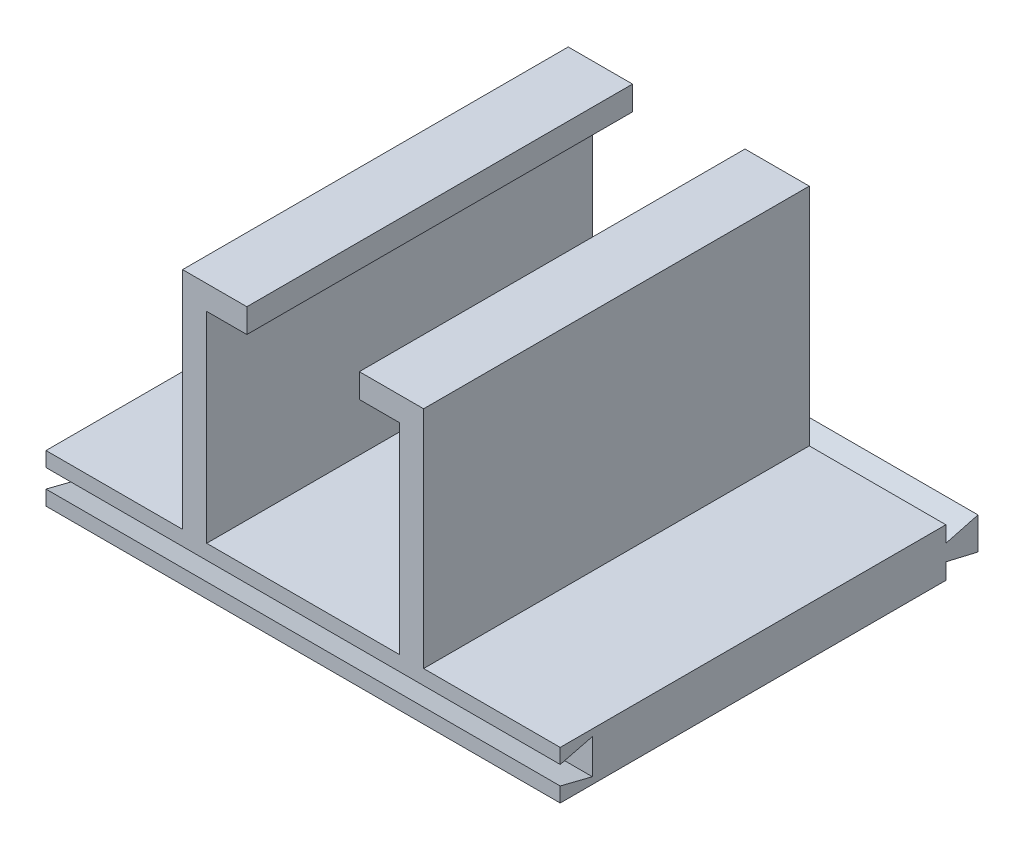
ISO-10303-21;
HEADER;
FILE_DESCRIPTION(('STEP AP214'),'2;1');
FILE_NAME('part.step','',(''),(''),'','','');
FILE_SCHEMA(('AUTOMOTIVE_DESIGN { 1 0 10303 214 1 1 1 1 }'));
ENDSEC;
DATA;
#1=APPLICATION_CONTEXT('core data for automotive mechanical design processes');
#2=APPLICATION_PROTOCOL_DEFINITION('international standard','automotive_design',2000,#1);
#3=PRODUCT_CONTEXT('',#1,'mechanical');
#4=PRODUCT('Part','Part','',(#3));
#5=PRODUCT_RELATED_PRODUCT_CATEGORY('part','',(#4));
#6=PRODUCT_DEFINITION_FORMATION('','',#4);
#7=PRODUCT_DEFINITION_CONTEXT('part definition',#1,'design');
#8=PRODUCT_DEFINITION('design','',#6,#7);
#9=PRODUCT_DEFINITION_SHAPE('','',#8);
#10=(LENGTH_UNIT() NAMED_UNIT(*) SI_UNIT(.MILLI.,.METRE.));
#11=(NAMED_UNIT(*) PLANE_ANGLE_UNIT() SI_UNIT($,.RADIAN.));
#12=(NAMED_UNIT(*) SI_UNIT($,.STERADIAN.) SOLID_ANGLE_UNIT());
#13=UNCERTAINTY_MEASURE_WITH_UNIT(LENGTH_MEASURE(1.E-05),#10,'distance_accuracy_value','');
#14=(GEOMETRIC_REPRESENTATION_CONTEXT(3) GLOBAL_UNCERTAINTY_ASSIGNED_CONTEXT((#13)) GLOBAL_UNIT_ASSIGNED_CONTEXT((#10,
#11,#12)) REPRESENTATION_CONTEXT('',''));
#15=CARTESIAN_POINT('',(0.,0.,0.));
#16=DIRECTION('',(0.,0.,1.));
#17=DIRECTION('',(1.,0.,0.));
#18=AXIS2_PLACEMENT_3D('',#15,#16,#17);
#19=CARTESIAN_POINT('',(0.,9.525,0.));
#20=DIRECTION('',(0.,0.,-1.));
#21=DIRECTION('',(-1.,0.,0.));
#22=AXIS2_PLACEMENT_3D('',#19,#20,#21);
#23=PLANE('',#22);
#24=DIRECTION('',(0.,-1.,0.));
#25=VECTOR('',#24,1.);
#26=CARTESIAN_POINT('',(101.6,9.525,0.));
#27=LINE('',#26,#25);
#28=CARTESIAN_POINT('',(101.6,2.921,0.));
#29=VERTEX_POINT('',#28);
#30=CARTESIAN_POINT('',(101.6,0.,0.));
#31=VERTEX_POINT('',#30);
#32=EDGE_CURVE('E434',#29,#31,#27,.T.);
#33=ORIENTED_EDGE('',*,*,#32,.F.);
#34=DIRECTION('',(1.,0.,0.));
#35=VECTOR('',#34,1.);
#36=CARTESIAN_POINT('',(0.,2.921,0.));
#37=LINE('',#36,#35);
#38=CARTESIAN_POINT('',(0.,2.921,0.));
#39=VERTEX_POINT('',#38);
#40=EDGE_CURVE('E234',#39,#29,#37,.T.);
#41=ORIENTED_EDGE('',*,*,#40,.F.);
#42=DIRECTION('',(0.,-1.,0.));
#43=VECTOR('',#42,1.);
#44=CARTESIAN_POINT('',(0.,9.525,0.));
#45=LINE('',#44,#43);
#46=CARTESIAN_POINT('',(0.,0.,0.));
#47=VERTEX_POINT('',#46);
#48=EDGE_CURVE('E48',#39,#47,#45,.T.);
#49=ORIENTED_EDGE('',*,*,#48,.T.);
#50=DIRECTION('',(1.,0.,0.));
#51=VECTOR('',#50,1.);
#52=CARTESIAN_POINT('',(0.,0.,0.));
#53=LINE('',#52,#51);
#54=EDGE_CURVE('E415',#47,#31,#53,.T.);
#55=ORIENTED_EDGE('',*,*,#54,.T.);
#56=EDGE_LOOP('',(#33,#41,#49,#55));
#57=FACE_BOUND('',#56,.T.);
#58=ADVANCED_FACE('F39',(#57),#23,.F.);
#59=CARTESIAN_POINT('',(0.,9.525,-76.2));
#60=DIRECTION('',(0.,0.,1.));
#61=DIRECTION('',(1.,0.,0.));
#62=AXIS2_PLACEMENT_3D('',#59,#60,#61);
#63=PLANE('',#62);
#64=DIRECTION('',(1.,0.,0.));
#65=VECTOR('',#64,1.);
#66=CARTESIAN_POINT('',(0.,6.35,-76.2));
#67=LINE('',#66,#65);
#68=CARTESIAN_POINT('',(0.,6.35,-76.2));
#69=VERTEX_POINT('',#68);
#70=CARTESIAN_POINT('',(101.6,6.35,-76.2));
#71=VERTEX_POINT('',#70);
#72=EDGE_CURVE('E269',#69,#71,#67,.T.);
#73=ORIENTED_EDGE('',*,*,#72,.F.);
#74=DIRECTION('',(0.,-1.,0.));
#75=VECTOR('',#74,1.);
#76=CARTESIAN_POINT('',(0.,9.525,-76.2));
#77=LINE('',#76,#75);
#78=CARTESIAN_POINT('',(0.,9.525,-76.2));
#79=VERTEX_POINT('',#78);
#80=EDGE_CURVE('E426',#79,#69,#77,.T.);
#81=ORIENTED_EDGE('',*,*,#80,.F.);
#82=DIRECTION('',(-1.,0.,0.));
#83=VECTOR('',#82,1.);
#84=CARTESIAN_POINT('',(0.,9.525,-76.2));
#85=LINE('',#84,#83);
#86=CARTESIAN_POINT('',(26.9875,9.525,-76.2));
#87=VERTEX_POINT('',#86);
#88=EDGE_CURVE('E407',#87,#79,#85,.T.);
#89=ORIENTED_EDGE('',*,*,#88,.F.);
#90=DIRECTION('',(0.,-1.,0.));
#91=VECTOR('',#90,1.);
#92=CARTESIAN_POINT('',(26.9875,53.975,-76.2));
#93=LINE('',#92,#91);
#94=CARTESIAN_POINT('',(26.9875,53.975,-76.2));
#95=VERTEX_POINT('',#94);
#96=EDGE_CURVE('E372',#95,#87,#93,.T.);
#97=ORIENTED_EDGE('',*,*,#96,.F.);
#98=DIRECTION('',(-1.,0.,0.));
#99=VECTOR('',#98,1.);
#100=CARTESIAN_POINT('',(26.9875,53.975,-76.2));
#101=LINE('',#100,#99);
#102=CARTESIAN_POINT('',(39.6875,53.975,-76.2));
#103=VERTEX_POINT('',#102);
#104=EDGE_CURVE('E369',#103,#95,#101,.T.);
#105=ORIENTED_EDGE('',*,*,#104,.F.);
#106=DIRECTION('',(0.,1.,0.));
#107=VECTOR('',#106,1.);
#108=CARTESIAN_POINT('',(39.6875,53.975,-76.2));
#109=LINE('',#108,#107);
#110=CARTESIAN_POINT('',(39.6875,49.2125,-76.2));
#111=VERTEX_POINT('',#110);
#112=EDGE_CURVE('E343',#111,#103,#109,.T.);
#113=ORIENTED_EDGE('',*,*,#112,.F.);
#114=DIRECTION('',(-1.,0.,0.));
#115=VECTOR('',#114,1.);
#116=CARTESIAN_POINT('',(39.6875,49.2125,-76.2));
#117=LINE('',#116,#115);
#118=CARTESIAN_POINT('',(31.75,49.2125,-76.2));
#119=VERTEX_POINT('',#118);
#120=EDGE_CURVE('E351',#111,#119,#117,.T.);
#121=ORIENTED_EDGE('',*,*,#120,.T.);
#122=DIRECTION('',(0.,-1.,0.));
#123=VECTOR('',#122,1.);
#124=CARTESIAN_POINT('',(31.75,53.975,-76.2));
#125=LINE('',#124,#123);
#126=CARTESIAN_POINT('',(31.75,9.525,-76.2));
#127=VERTEX_POINT('',#126);
#128=EDGE_CURVE('E382',#119,#127,#125,.T.);
#129=ORIENTED_EDGE('',*,*,#128,.T.);
#130=CARTESIAN_POINT('',(69.85,9.525,-76.2));
#131=VERTEX_POINT('',#130);
#132=EDGE_CURVE('E412',#131,#127,#85,.T.);
#133=ORIENTED_EDGE('',*,*,#132,.F.);
#134=DIRECTION('',(0.,-1.,0.));
#135=VECTOR('',#134,1.);
#136=CARTESIAN_POINT('',(69.85,53.975,-76.2));
#137=LINE('',#136,#135);
#138=CARTESIAN_POINT('',(69.85,49.2125,-76.2));
#139=VERTEX_POINT('',#138);
#140=EDGE_CURVE('E328',#139,#131,#137,.T.);
#141=ORIENTED_EDGE('',*,*,#140,.F.);
#142=DIRECTION('',(1.,0.,0.));
#143=VECTOR('',#142,1.);
#144=CARTESIAN_POINT('',(61.9125,49.2125,-76.2));
#145=LINE('',#144,#143);
#146=CARTESIAN_POINT('',(61.9125,49.2125,-76.2));
#147=VERTEX_POINT('',#146);
#148=EDGE_CURVE('E299',#147,#139,#145,.T.);
#149=ORIENTED_EDGE('',*,*,#148,.F.);
#150=DIRECTION('',(0.,1.,0.));
#151=VECTOR('',#150,1.);
#152=CARTESIAN_POINT('',(61.9125,53.975,-76.2));
#153=LINE('',#152,#151);
#154=CARTESIAN_POINT('',(61.9125,53.975,-76.2));
#155=VERTEX_POINT('',#154);
#156=EDGE_CURVE('E285',#147,#155,#153,.T.);
#157=ORIENTED_EDGE('',*,*,#156,.T.);
#158=DIRECTION('',(1.,0.,0.));
#159=VECTOR('',#158,1.);
#160=CARTESIAN_POINT('',(74.6125,53.975,-76.2));
#161=LINE('',#160,#159);
#162=CARTESIAN_POINT('',(74.6125,53.975,-76.2));
#163=VERTEX_POINT('',#162);
#164=EDGE_CURVE('E308',#155,#163,#161,.T.);
#165=ORIENTED_EDGE('',*,*,#164,.T.);
#166=DIRECTION('',(0.,-1.,0.));
#167=VECTOR('',#166,1.);
#168=CARTESIAN_POINT('',(74.6125,53.975,-76.2));
#169=LINE('',#168,#167);
#170=CARTESIAN_POINT('',(74.6125,9.525,-76.2));
#171=VERTEX_POINT('',#170);
#172=EDGE_CURVE('E331',#163,#171,#169,.T.);
#173=ORIENTED_EDGE('',*,*,#172,.T.);
#174=CARTESIAN_POINT('',(101.6,9.525,-76.2));
#175=VERTEX_POINT('',#174);
#176=EDGE_CURVE('E408',#175,#171,#85,.T.);
#177=ORIENTED_EDGE('',*,*,#176,.F.);
#178=DIRECTION('',(0.,-1.,0.));
#179=VECTOR('',#178,1.);
#180=CARTESIAN_POINT('',(101.6,9.525,-76.2));
#181=LINE('',#180,#179);
#182=EDGE_CURVE('E431',#175,#71,#181,.T.);
#183=ORIENTED_EDGE('',*,*,#182,.T.);
#184=EDGE_LOOP('',(#73,#81,#89,#97,#105,#113,#121,#129,#133,#141,#149,#157,#165,#173,#177,#183));
#185=FACE_BOUND('',#184,.T.);
#186=ADVANCED_FACE('F475',(#185),#63,.F.);
#187=CARTESIAN_POINT('',(0.,9.525,0.));
#188=DIRECTION('',(0.,-1.,0.));
#189=DIRECTION('',(0.,0.,-1.));
#190=AXIS2_PLACEMENT_3D('',#187,#188,#189);
#191=PLANE('',#190);
#192=ORIENTED_EDGE('',*,*,#176,.T.);
#193=DIRECTION('',(0.,0.,1.));
#194=VECTOR('',#193,1.);
#195=CARTESIAN_POINT('',(74.6125,9.525,0.));
#196=LINE('',#195,#194);
#197=CARTESIAN_POINT('',(74.6125,9.525,0.));
#198=VERTEX_POINT('',#197);
#199=EDGE_CURVE('E303',#171,#198,#196,.T.);
#200=ORIENTED_EDGE('',*,*,#199,.T.);
#201=DIRECTION('',(1.,0.,0.));
#202=VECTOR('',#201,1.);
#203=CARTESIAN_POINT('',(0.,9.525,0.));
#204=LINE('',#203,#202);
#205=CARTESIAN_POINT('',(101.6,9.525,0.));
#206=VERTEX_POINT('',#205);
#207=EDGE_CURVE('E398',#198,#206,#204,.T.);
#208=ORIENTED_EDGE('',*,*,#207,.T.);
#209=DIRECTION('',(0.,0.,-1.));
#210=VECTOR('',#209,1.);
#211=CARTESIAN_POINT('',(101.6,9.525,0.));
#212=LINE('',#211,#210);
#213=EDGE_CURVE('E403',#206,#175,#212,.T.);
#214=ORIENTED_EDGE('',*,*,#213,.T.);
#215=EDGE_LOOP('',(#192,#200,#208,#214));
#216=FACE_BOUND('',#215,.T.);
#217=ADVANCED_FACE('F466',(#216),#191,.F.);
#218=CARTESIAN_POINT('',(31.75,53.975,0.));
#219=DIRECTION('',(-1.,0.,0.));
#220=DIRECTION('',(0.,0.,1.));
#221=AXIS2_PLACEMENT_3D('',#218,#219,#220);
#222=PLANE('',#221);
#223=DIRECTION('',(0.,0.,-1.));
#224=VECTOR('',#223,1.);
#225=CARTESIAN_POINT('',(31.75,49.2125,0.));
#226=LINE('',#225,#224);
#227=CARTESIAN_POINT('',(31.75,49.2125,0.));
#228=VERTEX_POINT('',#227);
#229=EDGE_CURVE('E335',#228,#119,#226,.T.);
#230=ORIENTED_EDGE('',*,*,#229,.F.);
#231=DIRECTION('',(0.,-1.,0.));
#232=VECTOR('',#231,1.);
#233=CARTESIAN_POINT('',(31.75,53.975,0.));
#234=LINE('',#233,#232);
#235=CARTESIAN_POINT('',(31.75,9.525,0.));
#236=VERTEX_POINT('',#235);
#237=EDGE_CURVE('E386',#228,#236,#234,.T.);
#238=ORIENTED_EDGE('',*,*,#237,.T.);
#239=DIRECTION('',(0.,0.,-1.));
#240=VECTOR('',#239,1.);
#241=CARTESIAN_POINT('',(31.75,9.525,0.));
#242=LINE('',#241,#240);
#243=EDGE_CURVE('E366',#236,#127,#242,.T.);
#244=ORIENTED_EDGE('',*,*,#243,.T.);
#245=ORIENTED_EDGE('',*,*,#128,.F.);
#246=EDGE_LOOP('',(#230,#238,#244,#245));
#247=FACE_BOUND('',#246,.T.);
#248=ADVANCED_FACE('F521',(#247),#222,.F.);
#249=DIRECTION('',(0.,0.,1.));
#250=VECTOR('',#249,1.);
#251=CARTESIAN_POINT('',(26.9875,9.525,0.));
#252=LINE('',#251,#250);
#253=CARTESIAN_POINT('',(26.9875,9.525,0.));
#254=VERTEX_POINT('',#253);
#255=EDGE_CURVE('E360',#87,#254,#252,.T.);
#256=ORIENTED_EDGE('',*,*,#255,.F.);
#257=ORIENTED_EDGE('',*,*,#88,.T.);
#258=DIRECTION('',(0.,0.,1.));
#259=VECTOR('',#258,1.);
#260=CARTESIAN_POINT('',(0.,9.525,0.));
#261=LINE('',#260,#259);
#262=CARTESIAN_POINT('',(0.,9.525,0.));
#263=VERTEX_POINT('',#262);
#264=EDGE_CURVE('E394',#79,#263,#261,.T.);
#265=ORIENTED_EDGE('',*,*,#264,.T.);
#266=EDGE_CURVE('E400',#263,#254,#204,.T.);
#267=ORIENTED_EDGE('',*,*,#266,.T.);
#268=EDGE_LOOP('',(#256,#257,#265,#267));
#269=FACE_BOUND('',#268,.T.);
#270=ADVANCED_FACE('F515',(#269),#191,.F.);
#271=CARTESIAN_POINT('',(69.85,9.525,0.));
#272=VERTEX_POINT('',#271);
#273=EDGE_CURVE('E404',#236,#272,#204,.T.);
#274=ORIENTED_EDGE('',*,*,#273,.T.);
#275=DIRECTION('',(0.,0.,-1.));
#276=VECTOR('',#275,1.);
#277=CARTESIAN_POINT('',(69.85,9.525,0.));
#278=LINE('',#277,#276);
#279=EDGE_CURVE('E309',#272,#131,#278,.T.);
#280=ORIENTED_EDGE('',*,*,#279,.T.);
#281=ORIENTED_EDGE('',*,*,#132,.T.);
#282=ORIENTED_EDGE('',*,*,#243,.F.);
#283=EDGE_LOOP('',(#274,#280,#281,#282));
#284=FACE_BOUND('',#283,.T.);
#285=ADVANCED_FACE('F511',(#284),#191,.F.);
#286=CARTESIAN_POINT('',(0.,9.525,0.));
#287=DIRECTION('',(1.,0.,0.));
#288=DIRECTION('',(0.,0.,-1.));
#289=AXIS2_PLACEMENT_3D('',#286,#287,#288);
#290=PLANE('',#289);
#291=ORIENTED_EDGE('',*,*,#48,.F.);
#292=DIRECTION('',(0.,-0.242535625036333,-0.970142500145332));
#293=VECTOR('',#292,1.);
#294=CARTESIAN_POINT('',(0.,1.3335,-6.35));
#295=LINE('',#294,#293);
#296=CARTESIAN_POINT('',(0.,1.3335,-6.35));
#297=VERTEX_POINT('',#296);
#298=EDGE_CURVE('E202',#39,#297,#295,.T.);
#299=ORIENTED_EDGE('',*,*,#298,.T.);
#300=DIRECTION('',(0.,1.,0.));
#301=VECTOR('',#300,1.);
#302=CARTESIAN_POINT('',(0.,8.1915,-6.35));
#303=LINE('',#302,#301);
#304=CARTESIAN_POINT('',(0.,8.1915,-6.35));
#305=VERTEX_POINT('',#304);
#306=EDGE_CURVE('E212',#297,#305,#303,.T.);
#307=ORIENTED_EDGE('',*,*,#306,.T.);
#308=DIRECTION('',(0.,-0.242535625036333,0.970142500145332));
#309=VECTOR('',#308,1.);
#310=CARTESIAN_POINT('',(0.,6.604,0.));
#311=LINE('',#310,#309);
#312=CARTESIAN_POINT('',(0.,6.604,0.));
#313=VERTEX_POINT('',#312);
#314=EDGE_CURVE('E209',#305,#313,#311,.T.);
#315=ORIENTED_EDGE('',*,*,#314,.T.);
#316=EDGE_CURVE('E11',#263,#313,#45,.T.);
#317=ORIENTED_EDGE('',*,*,#316,.F.);
#318=ORIENTED_EDGE('',*,*,#264,.F.);
#319=ORIENTED_EDGE('',*,*,#80,.T.);
#320=DIRECTION('',(0.,-0.256185627352208,0.96662760375346));
#321=VECTOR('',#320,1.);
#322=CARTESIAN_POINT('',(0.,6.35,-76.2));
#323=LINE('',#322,#321);
#324=CARTESIAN_POINT('',(0.,8.03294255964723,-82.55));
#325=VERTEX_POINT('',#324);
#326=EDGE_CURVE('E252',#325,#69,#323,.T.);
#327=ORIENTED_EDGE('',*,*,#326,.F.);
#328=DIRECTION('',(0.,1.,0.));
#329=VECTOR('',#328,1.);
#330=CARTESIAN_POINT('',(0.,8.03294255964723,-82.55));
#331=LINE('',#330,#329);
#332=CARTESIAN_POINT('',(0.,1.68223067320307,-82.55));
#333=VERTEX_POINT('',#332);
#334=EDGE_CURVE('E247',#333,#325,#331,.T.);
#335=ORIENTED_EDGE('',*,*,#334,.F.);
#336=DIRECTION('',(0.,-0.228843473084288,-0.973463232395924));
#337=VECTOR('',#336,1.);
#338=CARTESIAN_POINT('',(0.,1.68223067320307,-82.55));
#339=LINE('',#338,#337);
#340=CARTESIAN_POINT('',(0.,3.175,-76.2));
#341=VERTEX_POINT('',#340);
#342=EDGE_CURVE('E243',#341,#333,#339,.T.);
#343=ORIENTED_EDGE('',*,*,#342,.F.);
#344=CARTESIAN_POINT('',(0.,0.,-76.2));
#345=VERTEX_POINT('',#344);
#346=EDGE_CURVE('E411',#341,#345,#77,.T.);
#347=ORIENTED_EDGE('',*,*,#346,.T.);
#348=DIRECTION('',(0.,0.,1.));
#349=VECTOR('',#348,1.);
#350=CARTESIAN_POINT('',(0.,0.,0.));
#351=LINE('',#350,#349);
#352=EDGE_CURVE('E393',#345,#47,#351,.T.);
#353=ORIENTED_EDGE('',*,*,#352,.T.);
#354=EDGE_LOOP('',(#291,#299,#307,#315,#317,#318,#319,#327,#335,#343,#347,#353));
#355=FACE_BOUND('',#354,.T.);
#356=ADVANCED_FACE('F41',(#355),#290,.F.);
#357=ORIENTED_EDGE('',*,*,#316,.T.);
#358=DIRECTION('',(1.,0.,0.));
#359=VECTOR('',#358,1.);
#360=CARTESIAN_POINT('',(0.,6.604,0.));
#361=LINE('',#360,#359);
#362=CARTESIAN_POINT('',(101.6,6.604,0.));
#363=VERTEX_POINT('',#362);
#364=EDGE_CURVE('E237',#313,#363,#361,.T.);
#365=ORIENTED_EDGE('',*,*,#364,.T.);
#366=EDGE_CURVE('E435',#206,#363,#27,.T.);
#367=ORIENTED_EDGE('',*,*,#366,.F.);
#368=ORIENTED_EDGE('',*,*,#207,.F.);
#369=DIRECTION('',(0.,-1.,0.));
#370=VECTOR('',#369,1.);
#371=CARTESIAN_POINT('',(74.6125,53.975,0.));
#372=LINE('',#371,#370);
#373=CARTESIAN_POINT('',(74.6125,53.975,0.));
#374=VERTEX_POINT('',#373);
#375=EDGE_CURVE('E316',#374,#198,#372,.T.);
#376=ORIENTED_EDGE('',*,*,#375,.F.);
#377=DIRECTION('',(-1.,0.,0.));
#378=VECTOR('',#377,1.);
#379=CARTESIAN_POINT('',(74.6125,53.975,0.));
#380=LINE('',#379,#378);
#381=CARTESIAN_POINT('',(61.9125,53.975,0.));
#382=VERTEX_POINT('',#381);
#383=EDGE_CURVE('E313',#374,#382,#380,.T.);
#384=ORIENTED_EDGE('',*,*,#383,.T.);
#385=DIRECTION('',(0.,-1.,0.));
#386=VECTOR('',#385,1.);
#387=CARTESIAN_POINT('',(61.9125,53.975,0.));
#388=LINE('',#387,#386);
#389=CARTESIAN_POINT('',(61.9125,49.2125,0.));
#390=VERTEX_POINT('',#389);
#391=EDGE_CURVE('E277',#382,#390,#388,.T.);
#392=ORIENTED_EDGE('',*,*,#391,.T.);
#393=DIRECTION('',(1.,0.,0.));
#394=VECTOR('',#393,1.);
#395=CARTESIAN_POINT('',(61.9125,49.2125,0.));
#396=LINE('',#395,#394);
#397=CARTESIAN_POINT('',(69.85,49.2125,0.));
#398=VERTEX_POINT('',#397);
#399=EDGE_CURVE('E293',#390,#398,#396,.T.);
#400=ORIENTED_EDGE('',*,*,#399,.T.);
#401=DIRECTION('',(0.,-1.,0.));
#402=VECTOR('',#401,1.);
#403=CARTESIAN_POINT('',(69.85,53.975,0.));
#404=LINE('',#403,#402);
#405=EDGE_CURVE('E325',#398,#272,#404,.T.);
#406=ORIENTED_EDGE('',*,*,#405,.T.);
#407=ORIENTED_EDGE('',*,*,#273,.F.);
#408=ORIENTED_EDGE('',*,*,#237,.F.);
#409=DIRECTION('',(-1.,0.,0.));
#410=VECTOR('',#409,1.);
#411=CARTESIAN_POINT('',(39.6875,49.2125,0.));
#412=LINE('',#411,#410);
#413=CARTESIAN_POINT('',(39.6875,49.2125,0.));
#414=VERTEX_POINT('',#413);
#415=EDGE_CURVE('E357',#414,#228,#412,.T.);
#416=ORIENTED_EDGE('',*,*,#415,.F.);
#417=DIRECTION('',(0.,-1.,0.));
#418=VECTOR('',#417,1.);
#419=CARTESIAN_POINT('',(39.6875,53.975,0.));
#420=LINE('',#419,#418);
#421=CARTESIAN_POINT('',(39.6875,53.975,0.));
#422=VERTEX_POINT('',#421);
#423=EDGE_CURVE('E336',#422,#414,#420,.T.);
#424=ORIENTED_EDGE('',*,*,#423,.F.);
#425=DIRECTION('',(1.,0.,0.));
#426=VECTOR('',#425,1.);
#427=CARTESIAN_POINT('',(26.9875,53.975,0.));
#428=LINE('',#427,#426);
#429=CARTESIAN_POINT('',(26.9875,53.975,0.));
#430=VERTEX_POINT('',#429);
#431=EDGE_CURVE('E365',#430,#422,#428,.T.);
#432=ORIENTED_EDGE('',*,*,#431,.F.);
#433=DIRECTION('',(0.,-1.,0.));
#434=VECTOR('',#433,1.);
#435=CARTESIAN_POINT('',(26.9875,53.975,0.));
#436=LINE('',#435,#434);
#437=EDGE_CURVE('E389',#430,#254,#436,.T.);
#438=ORIENTED_EDGE('',*,*,#437,.T.);
#439=ORIENTED_EDGE('',*,*,#266,.F.);
#440=EDGE_LOOP('',(#357,#365,#367,#368,#376,#384,#392,#400,#406,#407,#408,#416,#424,#432,#438,#439));
#441=FACE_BOUND('',#440,.T.);
#442=ADVANCED_FACE('F470',(#441),#23,.F.);
#443=CARTESIAN_POINT('',(101.6,9.525,0.));
#444=DIRECTION('',(-1.,0.,0.));
#445=DIRECTION('',(0.,0.,1.));
#446=AXIS2_PLACEMENT_3D('',#443,#444,#445);
#447=PLANE('',#446);
#448=DIRECTION('',(0.,1.,0.));
#449=VECTOR('',#448,1.);
#450=CARTESIAN_POINT('',(101.6,8.1915,-6.35));
#451=LINE('',#450,#449);
#452=CARTESIAN_POINT('',(101.6,1.3335,-6.35));
#453=VERTEX_POINT('',#452);
#454=CARTESIAN_POINT('',(101.6,8.1915,-6.35));
#455=VERTEX_POINT('',#454);
#456=EDGE_CURVE('E225',#453,#455,#451,.T.);
#457=ORIENTED_EDGE('',*,*,#456,.F.);
#458=DIRECTION('',(0.,-0.242535625036333,-0.970142500145332));
#459=VECTOR('',#458,1.);
#460=CARTESIAN_POINT('',(101.6,1.3335,-6.35));
#461=LINE('',#460,#459);
#462=EDGE_CURVE('E55',#29,#453,#461,.T.);
#463=ORIENTED_EDGE('',*,*,#462,.F.);
#464=ORIENTED_EDGE('',*,*,#32,.T.);
#465=DIRECTION('',(0.,0.,-1.));
#466=VECTOR('',#465,1.);
#467=CARTESIAN_POINT('',(101.6,0.,0.));
#468=LINE('',#467,#466);
#469=CARTESIAN_POINT('',(101.6,0.,-76.2));
#470=VERTEX_POINT('',#469);
#471=EDGE_CURVE('E419',#31,#470,#468,.T.);
#472=ORIENTED_EDGE('',*,*,#471,.T.);
#473=CARTESIAN_POINT('',(101.6,3.175,-76.2));
#474=VERTEX_POINT('',#473);
#475=EDGE_CURVE('E430',#474,#470,#181,.T.);
#476=ORIENTED_EDGE('',*,*,#475,.F.);
#477=DIRECTION('',(0.,-0.228843473084288,-0.973463232395924));
#478=VECTOR('',#477,1.);
#479=CARTESIAN_POINT('',(101.6,1.68223067320307,-82.55));
#480=LINE('',#479,#478);
#481=CARTESIAN_POINT('',(101.6,1.68223067320307,-82.55));
#482=VERTEX_POINT('',#481);
#483=EDGE_CURVE('E63',#474,#482,#480,.T.);
#484=ORIENTED_EDGE('',*,*,#483,.T.);
#485=DIRECTION('',(0.,1.,0.));
#486=VECTOR('',#485,1.);
#487=CARTESIAN_POINT('',(101.6,8.03294255964723,-82.55));
#488=LINE('',#487,#486);
#489=CARTESIAN_POINT('',(101.6,8.03294255964723,-82.55));
#490=VERTEX_POINT('',#489);
#491=EDGE_CURVE('E258',#482,#490,#488,.T.);
#492=ORIENTED_EDGE('',*,*,#491,.T.);
#493=DIRECTION('',(0.,-0.256185627352208,0.96662760375346));
#494=VECTOR('',#493,1.);
#495=CARTESIAN_POINT('',(101.6,6.35,-76.2));
#496=LINE('',#495,#494);
#497=EDGE_CURVE('E248',#490,#71,#496,.T.);
#498=ORIENTED_EDGE('',*,*,#497,.T.);
#499=ORIENTED_EDGE('',*,*,#182,.F.);
#500=ORIENTED_EDGE('',*,*,#213,.F.);
#501=ORIENTED_EDGE('',*,*,#366,.T.);
#502=DIRECTION('',(0.,-0.242535625036333,0.970142500145332));
#503=VECTOR('',#502,1.);
#504=CARTESIAN_POINT('',(101.6,6.604,0.));
#505=LINE('',#504,#503);
#506=EDGE_CURVE('E222',#455,#363,#505,.T.);
#507=ORIENTED_EDGE('',*,*,#506,.F.);
#508=EDGE_LOOP('',(#457,#463,#464,#472,#476,#484,#492,#498,#499,#500,#501,#507));
#509=FACE_BOUND('',#508,.T.);
#510=ADVANCED_FACE('F445',(#509),#447,.F.);
#511=ORIENTED_EDGE('',*,*,#346,.F.);
#512=DIRECTION('',(1.,0.,0.));
#513=VECTOR('',#512,1.);
#514=CARTESIAN_POINT('',(0.,3.175,-76.2));
#515=LINE('',#514,#513);
#516=EDGE_CURVE('E265',#341,#474,#515,.T.);
#517=ORIENTED_EDGE('',*,*,#516,.T.);
#518=ORIENTED_EDGE('',*,*,#475,.T.);
#519=DIRECTION('',(-1.,0.,0.));
#520=VECTOR('',#519,1.);
#521=CARTESIAN_POINT('',(0.,0.,-76.2));
#522=LINE('',#521,#520);
#523=EDGE_CURVE('E399',#470,#345,#522,.T.);
#524=ORIENTED_EDGE('',*,*,#523,.T.);
#525=EDGE_LOOP('',(#511,#517,#518,#524));
#526=FACE_BOUND('',#525,.T.);
#527=ADVANCED_FACE('F456',(#526),#63,.F.);
#528=CARTESIAN_POINT('',(0.,0.,0.));
#529=DIRECTION('',(0.,-1.,0.));
#530=DIRECTION('',(0.,0.,-1.));
#531=AXIS2_PLACEMENT_3D('',#528,#529,#530);
#532=PLANE('',#531);
#533=ORIENTED_EDGE('',*,*,#352,.F.);
#534=ORIENTED_EDGE('',*,*,#523,.F.);
#535=ORIENTED_EDGE('',*,*,#471,.F.);
#536=ORIENTED_EDGE('',*,*,#54,.F.);
#537=EDGE_LOOP('',(#533,#534,#535,#536));
#538=FACE_BOUND('',#537,.T.);
#539=ADVANCED_FACE('F453',(#538),#532,.T.);
#540=CARTESIAN_POINT('',(26.9875,53.975,0.));
#541=DIRECTION('',(1.,0.,0.));
#542=DIRECTION('',(0.,0.,-1.));
#543=AXIS2_PLACEMENT_3D('',#540,#541,#542);
#544=PLANE('',#543);
#545=ORIENTED_EDGE('',*,*,#255,.T.);
#546=ORIENTED_EDGE('',*,*,#437,.F.);
#547=DIRECTION('',(0.,0.,1.));
#548=VECTOR('',#547,1.);
#549=CARTESIAN_POINT('',(26.9875,53.975,0.));
#550=LINE('',#549,#548);
#551=EDGE_CURVE('E361',#95,#430,#550,.T.);
#552=ORIENTED_EDGE('',*,*,#551,.F.);
#553=ORIENTED_EDGE('',*,*,#96,.T.);
#554=EDGE_LOOP('',(#545,#546,#552,#553));
#555=FACE_BOUND('',#554,.T.);
#556=ADVANCED_FACE('F537',(#555),#544,.F.);
#557=CARTESIAN_POINT('',(0.,53.975,0.));
#558=DIRECTION('',(0.,-1.,0.));
#559=DIRECTION('',(0.,0.,-1.));
#560=AXIS2_PLACEMENT_3D('',#557,#558,#559);
#561=PLANE('',#560);
#562=ORIENTED_EDGE('',*,*,#551,.T.);
#563=ORIENTED_EDGE('',*,*,#431,.T.);
#564=DIRECTION('',(0.,0.,1.));
#565=VECTOR('',#564,1.);
#566=CARTESIAN_POINT('',(39.6875,53.975,0.));
#567=LINE('',#566,#565);
#568=EDGE_CURVE('E347',#103,#422,#567,.T.);
#569=ORIENTED_EDGE('',*,*,#568,.F.);
#570=ORIENTED_EDGE('',*,*,#104,.T.);
#571=EDGE_LOOP('',(#562,#563,#569,#570));
#572=FACE_BOUND('',#571,.T.);
#573=ADVANCED_FACE('F535',(#572),#561,.F.);
#574=CARTESIAN_POINT('',(39.6875,49.2125,0.));
#575=DIRECTION('',(0.,1.,0.));
#576=DIRECTION('',(0.,0.,1.));
#577=AXIS2_PLACEMENT_3D('',#574,#575,#576);
#578=PLANE('',#577);
#579=ORIENTED_EDGE('',*,*,#229,.T.);
#580=ORIENTED_EDGE('',*,*,#120,.F.);
#581=DIRECTION('',(0.,0.,-1.));
#582=VECTOR('',#581,1.);
#583=CARTESIAN_POINT('',(39.6875,49.2125,0.));
#584=LINE('',#583,#582);
#585=EDGE_CURVE('E340',#414,#111,#584,.T.);
#586=ORIENTED_EDGE('',*,*,#585,.F.);
#587=ORIENTED_EDGE('',*,*,#415,.T.);
#588=EDGE_LOOP('',(#579,#580,#586,#587));
#589=FACE_BOUND('',#588,.T.);
#590=ADVANCED_FACE('F544',(#589),#578,.F.);
#591=CARTESIAN_POINT('',(39.6875,0.,0.));
#592=DIRECTION('',(1.,0.,0.));
#593=DIRECTION('',(0.,0.,-1.));
#594=AXIS2_PLACEMENT_3D('',#591,#592,#593);
#595=PLANE('',#594);
#596=ORIENTED_EDGE('',*,*,#423,.T.);
#597=ORIENTED_EDGE('',*,*,#585,.T.);
#598=ORIENTED_EDGE('',*,*,#112,.T.);
#599=ORIENTED_EDGE('',*,*,#568,.T.);
#600=EDGE_LOOP('',(#596,#597,#598,#599));
#601=FACE_BOUND('',#600,.T.);
#602=ADVANCED_FACE('F559',(#601),#595,.T.);
#603=CARTESIAN_POINT('',(74.6125,53.975,0.));
#604=DIRECTION('',(1.,0.,0.));
#605=DIRECTION('',(0.,0.,-1.));
#606=AXIS2_PLACEMENT_3D('',#603,#604,#605);
#607=PLANE('',#606);
#608=ORIENTED_EDGE('',*,*,#199,.F.);
#609=ORIENTED_EDGE('',*,*,#172,.F.);
#610=DIRECTION('',(0.,0.,1.));
#611=VECTOR('',#610,1.);
#612=CARTESIAN_POINT('',(74.6125,53.975,0.));
#613=LINE('',#612,#611);
#614=EDGE_CURVE('E304',#163,#374,#613,.T.);
#615=ORIENTED_EDGE('',*,*,#614,.T.);
#616=ORIENTED_EDGE('',*,*,#375,.T.);
#617=EDGE_LOOP('',(#608,#609,#615,#616));
#618=FACE_BOUND('',#617,.T.);
#619=ADVANCED_FACE('F478',(#618),#607,.T.);
#620=CARTESIAN_POINT('',(69.85,53.975,0.));
#621=DIRECTION('',(-1.,0.,0.));
#622=DIRECTION('',(0.,0.,1.));
#623=AXIS2_PLACEMENT_3D('',#620,#621,#622);
#624=PLANE('',#623);
#625=DIRECTION('',(0.,0.,-1.));
#626=VECTOR('',#625,1.);
#627=CARTESIAN_POINT('',(69.85,49.2125,0.));
#628=LINE('',#627,#626);
#629=EDGE_CURVE('E268',#398,#139,#628,.T.);
#630=ORIENTED_EDGE('',*,*,#629,.T.);
#631=ORIENTED_EDGE('',*,*,#140,.T.);
#632=ORIENTED_EDGE('',*,*,#279,.F.);
#633=ORIENTED_EDGE('',*,*,#405,.F.);
#634=EDGE_LOOP('',(#630,#631,#632,#633));
#635=FACE_BOUND('',#634,.T.);
#636=ADVANCED_FACE('F490',(#635),#624,.T.);
#637=CARTESIAN_POINT('',(101.6,53.975,0.));
#638=DIRECTION('',(0.,-1.,0.));
#639=DIRECTION('',(0.,0.,-1.));
#640=AXIS2_PLACEMENT_3D('',#637,#638,#639);
#641=PLANE('',#640);
#642=ORIENTED_EDGE('',*,*,#614,.F.);
#643=ORIENTED_EDGE('',*,*,#164,.F.);
#644=DIRECTION('',(0.,0.,1.));
#645=VECTOR('',#644,1.);
#646=CARTESIAN_POINT('',(61.9125,53.975,0.));
#647=LINE('',#646,#645);
#648=EDGE_CURVE('E281',#155,#382,#647,.T.);
#649=ORIENTED_EDGE('',*,*,#648,.T.);
#650=ORIENTED_EDGE('',*,*,#383,.F.);
#651=EDGE_LOOP('',(#642,#643,#649,#650));
#652=FACE_BOUND('',#651,.T.);
#653=ADVANCED_FACE('F487',(#652),#641,.F.);
#654=CARTESIAN_POINT('',(61.9125,49.2125,0.));
#655=DIRECTION('',(0.,-1.,0.));
#656=DIRECTION('',(0.,0.,-1.));
#657=AXIS2_PLACEMENT_3D('',#654,#655,#656);
#658=PLANE('',#657);
#659=ORIENTED_EDGE('',*,*,#629,.F.);
#660=ORIENTED_EDGE('',*,*,#399,.F.);
#661=DIRECTION('',(0.,0.,-1.));
#662=VECTOR('',#661,1.);
#663=CARTESIAN_POINT('',(61.9125,49.2125,0.));
#664=LINE('',#663,#662);
#665=EDGE_CURVE('E289',#390,#147,#664,.T.);
#666=ORIENTED_EDGE('',*,*,#665,.T.);
#667=ORIENTED_EDGE('',*,*,#148,.T.);
#668=EDGE_LOOP('',(#659,#660,#666,#667));
#669=FACE_BOUND('',#668,.T.);
#670=ADVANCED_FACE('F489',(#669),#658,.T.);
#671=CARTESIAN_POINT('',(61.9125,0.,0.));
#672=DIRECTION('',(-1.,0.,0.));
#673=DIRECTION('',(0.,0.,-1.));
#674=AXIS2_PLACEMENT_3D('',#671,#672,#673);
#675=PLANE('',#674);
#676=ORIENTED_EDGE('',*,*,#391,.F.);
#677=ORIENTED_EDGE('',*,*,#648,.F.);
#678=ORIENTED_EDGE('',*,*,#156,.F.);
#679=ORIENTED_EDGE('',*,*,#665,.F.);
#680=EDGE_LOOP('',(#676,#677,#678,#679));
#681=FACE_BOUND('',#680,.T.);
#682=ADVANCED_FACE('F485',(#681),#675,.T.);
#683=CARTESIAN_POINT('',(0.,1.68223067320307,-82.55));
#684=DIRECTION('',(0.,-0.973463232395924,0.228843473084288));
#685=DIRECTION('',(0.,-0.228843473084288,-0.973463232395924));
#686=AXIS2_PLACEMENT_3D('',#683,#684,#685);
#687=PLANE('',#686);
#688=ORIENTED_EDGE('',*,*,#483,.F.);
#689=ORIENTED_EDGE('',*,*,#516,.F.);
#690=ORIENTED_EDGE('',*,*,#342,.T.);
#691=DIRECTION('',(1.,0.,0.));
#692=VECTOR('',#691,1.);
#693=CARTESIAN_POINT('',(0.,1.68223067320307,-82.55));
#694=LINE('',#693,#692);
#695=EDGE_CURVE('E255',#333,#482,#694,.T.);
#696=ORIENTED_EDGE('',*,*,#695,.T.);
#697=EDGE_LOOP('',(#688,#689,#690,#696));
#698=FACE_BOUND('',#697,.T.);
#699=ADVANCED_FACE('F606',(#698),#687,.T.);
#700=CARTESIAN_POINT('',(0.,6.35,-76.2));
#701=DIRECTION('',(0.,0.96662760375346,0.256185627352208));
#702=DIRECTION('',(0.,-0.256185627352208,0.96662760375346));
#703=AXIS2_PLACEMENT_3D('',#700,#701,#702);
#704=PLANE('',#703);
#705=ORIENTED_EDGE('',*,*,#497,.F.);
#706=DIRECTION('',(1.,0.,0.));
#707=VECTOR('',#706,1.);
#708=CARTESIAN_POINT('',(0.,8.03294255964723,-82.55));
#709=LINE('',#708,#707);
#710=EDGE_CURVE('E272',#325,#490,#709,.T.);
#711=ORIENTED_EDGE('',*,*,#710,.F.);
#712=ORIENTED_EDGE('',*,*,#326,.T.);
#713=ORIENTED_EDGE('',*,*,#72,.T.);
#714=EDGE_LOOP('',(#705,#711,#712,#713));
#715=FACE_BOUND('',#714,.T.);
#716=ADVANCED_FACE('F632',(#715),#704,.T.);
#717=CARTESIAN_POINT('',(0.,8.03294255964723,-82.55));
#718=DIRECTION('',(0.,0.,-1.));
#719=DIRECTION('',(-1.,0.,0.));
#720=AXIS2_PLACEMENT_3D('',#717,#718,#719);
#721=PLANE('',#720);
#722=ORIENTED_EDGE('',*,*,#491,.F.);
#723=ORIENTED_EDGE('',*,*,#695,.F.);
#724=ORIENTED_EDGE('',*,*,#334,.T.);
#725=ORIENTED_EDGE('',*,*,#710,.T.);
#726=EDGE_LOOP('',(#722,#723,#724,#725));
#727=FACE_BOUND('',#726,.T.);
#728=ADVANCED_FACE('F642',(#727),#721,.T.);
#729=CARTESIAN_POINT('',(0.,1.3335,-6.35));
#730=DIRECTION('',(0.,-0.970142500145332,0.242535625036333));
#731=DIRECTION('',(0.,-0.242535625036333,-0.970142500145332));
#732=AXIS2_PLACEMENT_3D('',#729,#730,#731);
#733=PLANE('',#732);
#734=ORIENTED_EDGE('',*,*,#462,.T.);
#735=DIRECTION('',(1.,0.,0.));
#736=VECTOR('',#735,1.);
#737=CARTESIAN_POINT('',(0.,1.3335,-6.35));
#738=LINE('',#737,#736);
#739=EDGE_CURVE('E198',#297,#453,#738,.T.);
#740=ORIENTED_EDGE('',*,*,#739,.F.);
#741=ORIENTED_EDGE('',*,*,#298,.F.);
#742=ORIENTED_EDGE('',*,*,#40,.T.);
#743=EDGE_LOOP('',(#734,#740,#741,#742));
#744=FACE_BOUND('',#743,.T.);
#745=ADVANCED_FACE('F200',(#744),#733,.F.);
#746=CARTESIAN_POINT('',(0.,6.604,0.));
#747=DIRECTION('',(0.,0.970142500145332,0.242535625036333));
#748=DIRECTION('',(0.,-0.242535625036333,0.970142500145332));
#749=AXIS2_PLACEMENT_3D('',#746,#747,#748);
#750=PLANE('',#749);
#751=ORIENTED_EDGE('',*,*,#506,.T.);
#752=ORIENTED_EDGE('',*,*,#364,.F.);
#753=ORIENTED_EDGE('',*,*,#314,.F.);
#754=DIRECTION('',(1.,0.,0.));
#755=VECTOR('',#754,1.);
#756=CARTESIAN_POINT('',(0.,8.1915,-6.35));
#757=LINE('',#756,#755);
#758=EDGE_CURVE('E208',#305,#455,#757,.T.);
#759=ORIENTED_EDGE('',*,*,#758,.T.);
#760=EDGE_LOOP('',(#751,#752,#753,#759));
#761=FACE_BOUND('',#760,.T.);
#762=ADVANCED_FACE('F681',(#761),#750,.F.);
#763=CARTESIAN_POINT('',(0.,8.1915,-6.35));
#764=DIRECTION('',(0.,0.,-1.));
#765=DIRECTION('',(0.,1.,0.));
#766=AXIS2_PLACEMENT_3D('',#763,#764,#765);
#767=PLANE('',#766);
#768=ORIENTED_EDGE('',*,*,#456,.T.);
#769=ORIENTED_EDGE('',*,*,#758,.F.);
#770=ORIENTED_EDGE('',*,*,#306,.F.);
#771=ORIENTED_EDGE('',*,*,#739,.T.);
#772=EDGE_LOOP('',(#768,#769,#770,#771));
#773=FACE_BOUND('',#772,.T.);
#774=ADVANCED_FACE('F213',(#773),#767,.F.);
#775=CLOSED_SHELL('',(#58,#186,#217,#248,#270,#285,#356,#442,#510,#527,#539,#556,#573,#590,#602,
#619,#636,#653,#670,#682,#699,#716,#728,#745,#762,#774));
#776=MANIFOLD_SOLID_BREP('B2',#775);
#777=ADVANCED_BREP_SHAPE_REPRESENTATION('',(#18,#776),#14);
#778=SHAPE_DEFINITION_REPRESENTATION(#9,#777);
ENDSEC;
END-ISO-10303-21;
